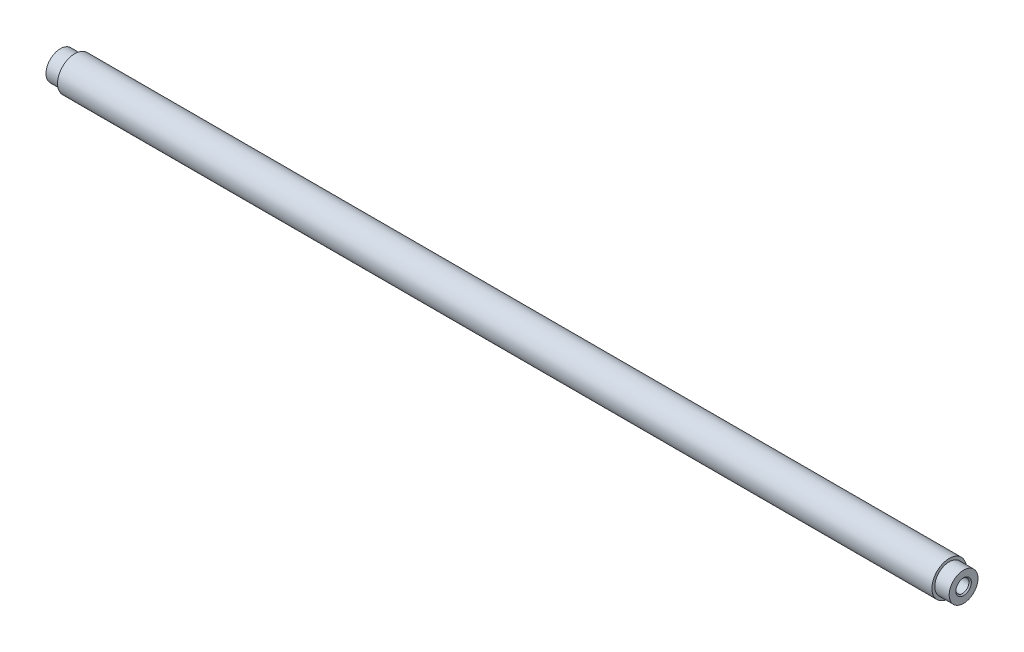
ISO-10303-21;
HEADER;
FILE_DESCRIPTION(('STEP AP214'),'2;1');
FILE_NAME('part.step','',(''),(''),'','','');
FILE_SCHEMA(('AUTOMOTIVE_DESIGN { 1 0 10303 214 1 1 1 1 }'));
ENDSEC;
DATA;
#1=APPLICATION_CONTEXT('core data for automotive mechanical design processes');
#2=APPLICATION_PROTOCOL_DEFINITION('international standard','automotive_design',2000,#1);
#3=PRODUCT_CONTEXT('',#1,'mechanical');
#4=PRODUCT('Part','Part','',(#3));
#5=PRODUCT_RELATED_PRODUCT_CATEGORY('part','',(#4));
#6=PRODUCT_DEFINITION_FORMATION('','',#4);
#7=PRODUCT_DEFINITION_CONTEXT('part definition',#1,'design');
#8=PRODUCT_DEFINITION('design','',#6,#7);
#9=PRODUCT_DEFINITION_SHAPE('','',#8);
#10=(LENGTH_UNIT() NAMED_UNIT(*) SI_UNIT(.MILLI.,.METRE.));
#11=(NAMED_UNIT(*) PLANE_ANGLE_UNIT() SI_UNIT($,.RADIAN.));
#12=(NAMED_UNIT(*) SI_UNIT($,.STERADIAN.) SOLID_ANGLE_UNIT());
#13=UNCERTAINTY_MEASURE_WITH_UNIT(LENGTH_MEASURE(1.E-05),#10,'distance_accuracy_value','');
#14=(GEOMETRIC_REPRESENTATION_CONTEXT(3) GLOBAL_UNCERTAINTY_ASSIGNED_CONTEXT((#13)) GLOBAL_UNIT_ASSIGNED_CONTEXT((#10,
#11,#12)) REPRESENTATION_CONTEXT('',''));
#15=CARTESIAN_POINT('',(0.,0.,0.));
#16=DIRECTION('',(0.,0.,1.));
#17=DIRECTION('',(1.,0.,0.));
#18=AXIS2_PLACEMENT_3D('',#15,#16,#17);
#19=CARTESIAN_POINT('',(-235.,0.,0.));
#20=DIRECTION('',(1.,0.,0.));
#21=DIRECTION('',(0.,1.,0.));
#22=AXIS2_PLACEMENT_3D('',#19,#20,#21);
#23=PLANE('',#22);
#24=CARTESIAN_POINT('',(-235.,0.,0.));
#25=DIRECTION('',(-1.,0.,0.));
#26=DIRECTION('',(0.,0.,1.));
#27=AXIS2_PLACEMENT_3D('',#24,#25,#26);
#28=CIRCLE('',#27,4.025);
#29=CARTESIAN_POINT('',(-235.,0.,4.025));
#30=VERTEX_POINT('',#29);
#31=EDGE_CURVE('E81',#30,#30,#28,.T.);
#32=ORIENTED_EDGE('',*,*,#31,.F.);
#33=EDGE_LOOP('',(#32));
#34=FACE_BOUND('',#33,.T.);
#35=CARTESIAN_POINT('',(-235.,0.,0.));
#36=DIRECTION('',(-1.,0.,0.));
#37=DIRECTION('',(0.,-1.,0.));
#38=AXIS2_PLACEMENT_3D('',#35,#36,#37);
#39=CIRCLE('',#38,7.5);
#40=CARTESIAN_POINT('',(-235.,-7.5,0.));
#41=VERTEX_POINT('',#40);
#42=EDGE_CURVE('E11',#41,#41,#39,.T.);
#43=ORIENTED_EDGE('',*,*,#42,.T.);
#44=EDGE_LOOP('',(#43));
#45=FACE_BOUND('',#44,.T.);
#46=ADVANCED_FACE('F47',(#34,#45),#23,.F.);
#47=CARTESIAN_POINT('',(-235.,0.,0.));
#48=DIRECTION('',(-1.,0.,0.));
#49=DIRECTION('',(0.,-1.,0.));
#50=AXIS2_PLACEMENT_3D('',#47,#48,#49);
#51=CYLINDRICAL_SURFACE('',#50,7.5);
#52=ORIENTED_EDGE('',*,*,#42,.F.);
#53=EDGE_LOOP('',(#52));
#54=FACE_BOUND('',#53,.T.);
#55=CARTESIAN_POINT('',(-227.5,0.,0.));
#56=DIRECTION('',(-1.,0.,0.));
#57=DIRECTION('',(0.,-1.,0.));
#58=AXIS2_PLACEMENT_3D('',#55,#56,#57);
#59=CIRCLE('',#58,7.5);
#60=CARTESIAN_POINT('',(-227.5,-7.49999999999999,0.));
#61=VERTEX_POINT('',#60);
#62=EDGE_CURVE('E55',#61,#61,#59,.T.);
#63=ORIENTED_EDGE('',*,*,#62,.T.);
#64=EDGE_LOOP('',(#63));
#65=FACE_BOUND('',#64,.T.);
#66=ADVANCED_FACE('F111',(#54,#65),#51,.T.);
#67=CARTESIAN_POINT('',(-227.5,7.5,0.));
#68=DIRECTION('',(1.,0.,0.));
#69=DIRECTION('',(0.,1.,0.));
#70=AXIS2_PLACEMENT_3D('',#67,#68,#69);
#71=PLANE('',#70);
#72=ORIENTED_EDGE('',*,*,#62,.F.);
#73=EDGE_LOOP('',(#72));
#74=FACE_BOUND('',#73,.T.);
#75=CARTESIAN_POINT('',(-227.5,0.,0.));
#76=DIRECTION('',(-1.,0.,0.));
#77=DIRECTION('',(0.,-1.,0.));
#78=AXIS2_PLACEMENT_3D('',#75,#76,#77);
#79=CIRCLE('',#78,9.);
#80=CARTESIAN_POINT('',(-227.5,-9.,0.));
#81=VERTEX_POINT('',#80);
#82=EDGE_CURVE('E104',#81,#81,#79,.T.);
#83=ORIENTED_EDGE('',*,*,#82,.T.);
#84=EDGE_LOOP('',(#83));
#85=FACE_BOUND('',#84,.T.);
#86=ADVANCED_FACE('F113',(#74,#85),#71,.F.);
#87=CARTESIAN_POINT('',(-235.,0.,0.));
#88=DIRECTION('',(-1.,0.,0.));
#89=DIRECTION('',(0.,-1.,0.));
#90=AXIS2_PLACEMENT_3D('',#87,#88,#89);
#91=CYLINDRICAL_SURFACE('',#90,8.99999999999995);
#92=ORIENTED_EDGE('',*,*,#82,.F.);
#93=EDGE_LOOP('',(#92));
#94=FACE_BOUND('',#93,.T.);
#95=CARTESIAN_POINT('',(227.5,0.,0.));
#96=DIRECTION('',(-1.,0.,0.));
#97=DIRECTION('',(0.,-1.,0.));
#98=AXIS2_PLACEMENT_3D('',#95,#96,#97);
#99=CIRCLE('',#98,8.99999999999991);
#100=CARTESIAN_POINT('',(227.5,-8.99999999999982,0.));
#101=VERTEX_POINT('',#100);
#102=EDGE_CURVE('E100',#101,#101,#99,.T.);
#103=ORIENTED_EDGE('',*,*,#102,.T.);
#104=EDGE_LOOP('',(#103));
#105=FACE_BOUND('',#104,.T.);
#106=ADVANCED_FACE('F116',(#94,#105),#91,.T.);
#107=CARTESIAN_POINT('',(227.5,9.,0.));
#108=DIRECTION('',(-1.,0.,0.));
#109=DIRECTION('',(0.,-1.,0.));
#110=AXIS2_PLACEMENT_3D('',#107,#108,#109);
#111=PLANE('',#110);
#112=ORIENTED_EDGE('',*,*,#102,.F.);
#113=EDGE_LOOP('',(#112));
#114=FACE_BOUND('',#113,.T.);
#115=CARTESIAN_POINT('',(227.5,0.,0.));
#116=DIRECTION('',(-1.,0.,0.));
#117=DIRECTION('',(0.,-1.,0.));
#118=AXIS2_PLACEMENT_3D('',#115,#116,#117);
#119=CIRCLE('',#118,7.49999999999991);
#120=CARTESIAN_POINT('',(227.5,-7.49999999999981,0.));
#121=VERTEX_POINT('',#120);
#122=EDGE_CURVE('E96',#121,#121,#119,.T.);
#123=ORIENTED_EDGE('',*,*,#122,.T.);
#124=EDGE_LOOP('',(#123));
#125=FACE_BOUND('',#124,.T.);
#126=ADVANCED_FACE('F122',(#114,#125),#111,.F.);
#127=CARTESIAN_POINT('',(-235.,0.,0.));
#128=DIRECTION('',(-1.,0.,0.));
#129=DIRECTION('',(0.,-1.,0.));
#130=AXIS2_PLACEMENT_3D('',#127,#128,#129);
#131=CYLINDRICAL_SURFACE('',#130,7.49999999999991);
#132=ORIENTED_EDGE('',*,*,#122,.F.);
#133=EDGE_LOOP('',(#132));
#134=FACE_BOUND('',#133,.T.);
#135=CARTESIAN_POINT('',(235.,0.,0.));
#136=DIRECTION('',(-1.,0.,0.));
#137=DIRECTION('',(0.,-1.,0.));
#138=AXIS2_PLACEMENT_3D('',#135,#136,#137);
#139=CIRCLE('',#138,7.49999999999991);
#140=CARTESIAN_POINT('',(235.,-7.49999999999981,0.));
#141=VERTEX_POINT('',#140);
#142=EDGE_CURVE('E92',#141,#141,#139,.T.);
#143=ORIENTED_EDGE('',*,*,#142,.T.);
#144=EDGE_LOOP('',(#143));
#145=FACE_BOUND('',#144,.T.);
#146=ADVANCED_FACE('F128',(#134,#145),#131,.T.);
#147=CARTESIAN_POINT('',(235.,7.5,0.));
#148=DIRECTION('',(-1.,0.,0.));
#149=DIRECTION('',(0.,-1.,0.));
#150=AXIS2_PLACEMENT_3D('',#147,#148,#149);
#151=PLANE('',#150);
#152=CARTESIAN_POINT('',(235.,0.,0.));
#153=DIRECTION('',(1.,0.,0.));
#154=DIRECTION('',(0.,0.,-1.));
#155=AXIS2_PLACEMENT_3D('',#152,#153,#154);
#156=CIRCLE('',#155,4.025);
#157=CARTESIAN_POINT('',(235.,0.,-4.025));
#158=VERTEX_POINT('',#157);
#159=EDGE_CURVE('E72',#158,#158,#156,.T.);
#160=ORIENTED_EDGE('',*,*,#159,.F.);
#161=EDGE_LOOP('',(#160));
#162=FACE_BOUND('',#161,.T.);
#163=ORIENTED_EDGE('',*,*,#142,.F.);
#164=EDGE_LOOP('',(#163));
#165=FACE_BOUND('',#164,.T.);
#166=ADVANCED_FACE('F134',(#162,#165),#151,.F.);
#167=CARTESIAN_POINT('',(215.,0.,0.));
#168=DIRECTION('',(1.,0.,0.));
#169=DIRECTION('',(0.,0.,-1.));
#170=AXIS2_PLACEMENT_3D('',#167,#168,#169);
#171=CONICAL_SURFACE('',#170,3.4,1.02974425867665);
#172=CARTESIAN_POINT('',(212.957073895306,0.,0.));
#173=VERTEX_POINT('',#172);
#174=VERTEX_LOOP('',#173);
#175=FACE_BOUND('',#174,.T.);
#176=CARTESIAN_POINT('',(215.,0.,0.));
#177=DIRECTION('',(1.,0.,0.));
#178=DIRECTION('',(0.,0.,-1.));
#179=AXIS2_PLACEMENT_3D('',#176,#177,#178);
#180=CIRCLE('',#179,3.4);
#181=CARTESIAN_POINT('',(215.,0.,-3.4));
#182=VERTEX_POINT('',#181);
#183=EDGE_CURVE('E88',#182,#182,#180,.T.);
#184=ORIENTED_EDGE('',*,*,#183,.T.);
#185=EDGE_LOOP('',(#184));
#186=FACE_BOUND('',#185,.T.);
#187=ADVANCED_FACE('F139',(#175,#186),#171,.F.);
#188=CARTESIAN_POINT('',(235.,0.,0.));
#189=DIRECTION('',(1.,0.,0.));
#190=DIRECTION('',(0.,0.,-1.));
#191=AXIS2_PLACEMENT_3D('',#188,#189,#190);
#192=CYLINDRICAL_SURFACE('',#191,3.4);
#193=ORIENTED_EDGE('',*,*,#183,.F.);
#194=EDGE_LOOP('',(#193));
#195=FACE_BOUND('',#194,.T.);
#196=CARTESIAN_POINT('',(234.375,0.,0.));
#197=DIRECTION('',(1.,0.,0.));
#198=DIRECTION('',(0.,0.,-1.));
#199=AXIS2_PLACEMENT_3D('',#196,#197,#198);
#200=CIRCLE('',#199,3.4);
#201=CARTESIAN_POINT('',(234.375,0.,-3.4));
#202=VERTEX_POINT('',#201);
#203=EDGE_CURVE('E78',#202,#202,#200,.T.);
#204=ORIENTED_EDGE('',*,*,#203,.T.);
#205=EDGE_LOOP('',(#204));
#206=FACE_BOUND('',#205,.T.);
#207=ADVANCED_FACE('F145',(#195,#206),#192,.F.);
#208=CARTESIAN_POINT('',(235.,0.,0.));
#209=DIRECTION('',(1.,0.,0.));
#210=DIRECTION('',(0.,0.,-1.));
#211=AXIS2_PLACEMENT_3D('',#208,#209,#210);
#212=CONICAL_SURFACE('',#211,4.025,0.78539816339744);
#213=ORIENTED_EDGE('',*,*,#203,.F.);
#214=EDGE_LOOP('',(#213));
#215=FACE_BOUND('',#214,.T.);
#216=ORIENTED_EDGE('',*,*,#159,.T.);
#217=EDGE_LOOP('',(#216));
#218=FACE_BOUND('',#217,.T.);
#219=ADVANCED_FACE('F65',(#215,#218),#212,.F.);
#220=CARTESIAN_POINT('',(-215.,0.,0.));
#221=DIRECTION('',(-1.,0.,0.));
#222=DIRECTION('',(0.,0.,1.));
#223=AXIS2_PLACEMENT_3D('',#220,#221,#222);
#224=CONICAL_SURFACE('',#223,3.4,1.02974425867665);
#225=CARTESIAN_POINT('',(-212.957073895306,0.,0.));
#226=VERTEX_POINT('',#225);
#227=VERTEX_LOOP('',#226);
#228=FACE_BOUND('',#227,.T.);
#229=CARTESIAN_POINT('',(-215.,0.,0.));
#230=DIRECTION('',(-1.,0.,0.));
#231=DIRECTION('',(0.,0.,1.));
#232=AXIS2_PLACEMENT_3D('',#229,#230,#231);
#233=CIRCLE('',#232,3.4);
#234=CARTESIAN_POINT('',(-215.,0.,3.4));
#235=VERTEX_POINT('',#234);
#236=EDGE_CURVE('E69',#235,#235,#233,.T.);
#237=ORIENTED_EDGE('',*,*,#236,.T.);
#238=EDGE_LOOP('',(#237));
#239=FACE_BOUND('',#238,.T.);
#240=ADVANCED_FACE('F61',(#228,#239),#224,.F.);
#241=CARTESIAN_POINT('',(-235.,0.,0.));
#242=DIRECTION('',(-1.,0.,0.));
#243=DIRECTION('',(0.,0.,1.));
#244=AXIS2_PLACEMENT_3D('',#241,#242,#243);
#245=CYLINDRICAL_SURFACE('',#244,3.4);
#246=ORIENTED_EDGE('',*,*,#236,.F.);
#247=EDGE_LOOP('',(#246));
#248=FACE_BOUND('',#247,.T.);
#249=CARTESIAN_POINT('',(-234.375,0.,0.));
#250=DIRECTION('',(-1.,0.,0.));
#251=DIRECTION('',(0.,0.,1.));
#252=AXIS2_PLACEMENT_3D('',#249,#250,#251);
#253=CIRCLE('',#252,3.4);
#254=CARTESIAN_POINT('',(-234.375,0.,3.4));
#255=VERTEX_POINT('',#254);
#256=EDGE_CURVE('E73',#255,#255,#253,.T.);
#257=ORIENTED_EDGE('',*,*,#256,.T.);
#258=EDGE_LOOP('',(#257));
#259=FACE_BOUND('',#258,.T.);
#260=ADVANCED_FACE('F64',(#248,#259),#245,.F.);
#261=CARTESIAN_POINT('',(-235.,0.,0.));
#262=DIRECTION('',(-1.,0.,0.));
#263=DIRECTION('',(0.,0.,1.));
#264=AXIS2_PLACEMENT_3D('',#261,#262,#263);
#265=CONICAL_SURFACE('',#264,4.025,0.78539816339744);
#266=ORIENTED_EDGE('',*,*,#256,.F.);
#267=EDGE_LOOP('',(#266));
#268=FACE_BOUND('',#267,.T.);
#269=ORIENTED_EDGE('',*,*,#31,.T.);
#270=EDGE_LOOP('',(#269));
#271=FACE_BOUND('',#270,.T.);
#272=ADVANCED_FACE('F160',(#268,#271),#265,.F.);
#273=CLOSED_SHELL('',(#46,#66,#86,#106,#126,#146,#166,#187,#207,#219,#240,#260,#272));
#274=MANIFOLD_SOLID_BREP('B2',#273);
#275=ADVANCED_BREP_SHAPE_REPRESENTATION('',(#18,#274),#14);
#276=SHAPE_DEFINITION_REPRESENTATION(#9,#275);
ENDSEC;
END-ISO-10303-21;
